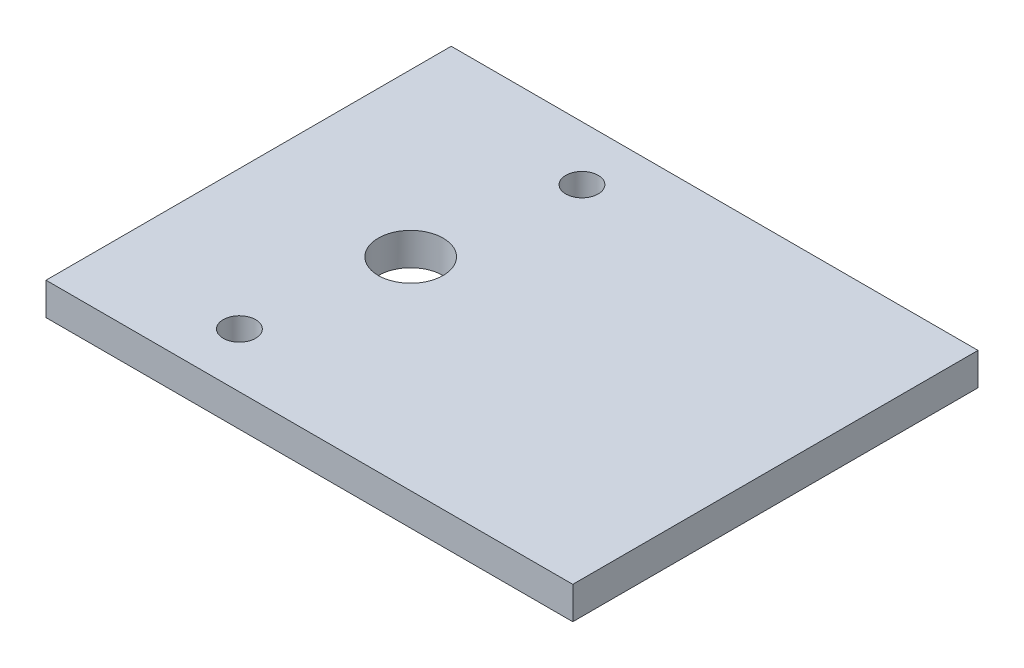
ISO-10303-21;
HEADER;
FILE_DESCRIPTION(('STEP AP214'),'2;1');
FILE_NAME('part.step','',(''),(''),'','','');
FILE_SCHEMA(('AUTOMOTIVE_DESIGN { 1 0 10303 214 1 1 1 1 }'));
ENDSEC;
DATA;
#1=APPLICATION_CONTEXT('core data for automotive mechanical design processes');
#2=APPLICATION_PROTOCOL_DEFINITION('international standard','automotive_design',2000,#1);
#3=PRODUCT_CONTEXT('',#1,'mechanical');
#4=PRODUCT('Part','Part','',(#3));
#5=PRODUCT_RELATED_PRODUCT_CATEGORY('part','',(#4));
#6=PRODUCT_DEFINITION_FORMATION('','',#4);
#7=PRODUCT_DEFINITION_CONTEXT('part definition',#1,'design');
#8=PRODUCT_DEFINITION('design','',#6,#7);
#9=PRODUCT_DEFINITION_SHAPE('','',#8);
#10=(LENGTH_UNIT() NAMED_UNIT(*) SI_UNIT(.MILLI.,.METRE.));
#11=(NAMED_UNIT(*) PLANE_ANGLE_UNIT() SI_UNIT($,.RADIAN.));
#12=(NAMED_UNIT(*) SI_UNIT($,.STERADIAN.) SOLID_ANGLE_UNIT());
#13=UNCERTAINTY_MEASURE_WITH_UNIT(LENGTH_MEASURE(1.E-05),#10,'distance_accuracy_value','');
#14=(GEOMETRIC_REPRESENTATION_CONTEXT(3) GLOBAL_UNCERTAINTY_ASSIGNED_CONTEXT((#13)) GLOBAL_UNIT_ASSIGNED_CONTEXT((#10,
#11,#12)) REPRESENTATION_CONTEXT('',''));
#15=CARTESIAN_POINT('',(0.,0.,0.));
#16=DIRECTION('',(0.,0.,1.));
#17=DIRECTION('',(1.,0.,0.));
#18=AXIS2_PLACEMENT_3D('',#15,#16,#17);
#19=CARTESIAN_POINT('',(0.,0.,50.));
#20=DIRECTION('',(1.,0.,0.));
#21=DIRECTION('',(0.,0.,-1.));
#22=AXIS2_PLACEMENT_3D('',#19,#20,#21);
#23=PLANE('',#22);
#24=DIRECTION('',(0.,-1.,0.));
#25=VECTOR('',#24,1.);
#26=CARTESIAN_POINT('',(0.,0.,0.));
#27=LINE('',#26,#25);
#28=CARTESIAN_POINT('',(0.,4.,0.));
#29=VERTEX_POINT('',#28);
#30=CARTESIAN_POINT('',(0.,0.,0.));
#31=VERTEX_POINT('',#30);
#32=EDGE_CURVE('E89',#29,#31,#27,.T.);
#33=ORIENTED_EDGE('',*,*,#32,.T.);
#34=DIRECTION('',(0.,0.,-1.));
#35=VECTOR('',#34,1.);
#36=CARTESIAN_POINT('',(0.,0.,50.));
#37=LINE('',#36,#35);
#38=CARTESIAN_POINT('',(0.,0.,50.));
#39=VERTEX_POINT('',#38);
#40=EDGE_CURVE('E44',#39,#31,#37,.T.);
#41=ORIENTED_EDGE('',*,*,#40,.F.);
#42=DIRECTION('',(0.,-1.,0.));
#43=VECTOR('',#42,1.);
#44=CARTESIAN_POINT('',(0.,0.,50.));
#45=LINE('',#44,#43);
#46=CARTESIAN_POINT('',(0.,4.,50.));
#47=VERTEX_POINT('',#46);
#48=EDGE_CURVE('E83',#47,#39,#45,.T.);
#49=ORIENTED_EDGE('',*,*,#48,.F.);
#50=DIRECTION('',(0.,0.,-1.));
#51=VECTOR('',#50,1.);
#52=CARTESIAN_POINT('',(0.,4.,50.));
#53=LINE('',#52,#51);
#54=EDGE_CURVE('E76',#47,#29,#53,.T.);
#55=ORIENTED_EDGE('',*,*,#54,.T.);
#56=EDGE_LOOP('',(#33,#41,#49,#55));
#57=FACE_BOUND('',#56,.T.);
#58=ADVANCED_FACE('F37',(#57),#23,.F.);
#59=CARTESIAN_POINT('',(90.,0.,50.));
#60=DIRECTION('',(0.,1.,0.));
#61=DIRECTION('',(-1.,0.,0.));
#62=AXIS2_PLACEMENT_3D('',#59,#60,#61);
#63=PLANE('',#62);
#64=CARTESIAN_POINT('',(17.1436625737536,0.,43.2781655673632));
#65=DIRECTION('',(0.,1.,0.));
#66=DIRECTION('',(-1.,0.,0.));
#67=AXIS2_PLACEMENT_3D('',#64,#65,#66);
#68=CIRCLE('',#67,1.99999999967667);
#69=CARTESIAN_POINT('',(15.1436625740769,0.,43.2781655673632));
#70=VERTEX_POINT('',#69);
#71=EDGE_CURVE('E115',#70,#70,#68,.T.);
#72=ORIENTED_EDGE('',*,*,#71,.T.);
#73=EDGE_LOOP('',(#72));
#74=FACE_BOUND('',#73,.T.);
#75=CARTESIAN_POINT('',(22.8563374269904,0.,6.72183443278139));
#76=DIRECTION('',(0.,1.,0.));
#77=DIRECTION('',(-1.,0.,0.));
#78=AXIS2_PLACEMENT_3D('',#75,#76,#77);
#79=CIRCLE('',#78,1.99999999965383);
#80=CARTESIAN_POINT('',(20.8563374273365,0.,6.72183443278139));
#81=VERTEX_POINT('',#80);
#82=EDGE_CURVE('E116',#81,#81,#79,.T.);
#83=ORIENTED_EDGE('',*,*,#82,.T.);
#84=EDGE_LOOP('',(#83));
#85=FACE_BOUND('',#84,.T.);
#86=CARTESIAN_POINT('',(20.,0.,25.));
#87=DIRECTION('',(0.,1.,0.));
#88=DIRECTION('',(-1.,0.,0.));
#89=AXIS2_PLACEMENT_3D('',#86,#87,#88);
#90=CIRCLE('',#89,4.);
#91=CARTESIAN_POINT('',(16.,0.,25.));
#92=VERTEX_POINT('',#91);
#93=EDGE_CURVE('E94',#92,#92,#90,.T.);
#94=ORIENTED_EDGE('',*,*,#93,.T.);
#95=EDGE_LOOP('',(#94));
#96=FACE_BOUND('',#95,.T.);
#97=DIRECTION('',(1.,0.,0.));
#98=VECTOR('',#97,1.);
#99=CARTESIAN_POINT('',(90.,0.,0.));
#100=LINE('',#99,#98);
#101=CARTESIAN_POINT('',(65.,0.,0.));
#102=VERTEX_POINT('',#101);
#103=EDGE_CURVE('E84',#31,#102,#100,.T.);
#104=ORIENTED_EDGE('',*,*,#103,.T.);
#105=DIRECTION('',(0.,0.,1.));
#106=VECTOR('',#105,1.);
#107=CARTESIAN_POINT('',(65.,0.,50.));
#108=LINE('',#107,#106);
#109=CARTESIAN_POINT('',(65.,0.,50.));
#110=VERTEX_POINT('',#109);
#111=EDGE_CURVE('E50',#102,#110,#108,.T.);
#112=ORIENTED_EDGE('',*,*,#111,.T.);
#113=DIRECTION('',(1.,0.,0.));
#114=VECTOR('',#113,1.);
#115=CARTESIAN_POINT('',(90.,0.,50.));
#116=LINE('',#115,#114);
#117=EDGE_CURVE('E105',#39,#110,#116,.T.);
#118=ORIENTED_EDGE('',*,*,#117,.F.);
#119=ORIENTED_EDGE('',*,*,#40,.T.);
#120=EDGE_LOOP('',(#104,#112,#118,#119));
#121=FACE_BOUND('',#120,.T.);
#122=ADVANCED_FACE('F103',(#74,#85,#96,#121),#63,.F.);
#123=CARTESIAN_POINT('',(0.,4.,50.));
#124=DIRECTION('',(0.,-1.,0.));
#125=DIRECTION('',(1.,0.,0.));
#126=AXIS2_PLACEMENT_3D('',#123,#124,#125);
#127=PLANE('',#126);
#128=CARTESIAN_POINT('',(17.1436625737536,4.,43.2781655673632));
#129=DIRECTION('',(0.,1.,0.));
#130=DIRECTION('',(-1.,0.,0.));
#131=AXIS2_PLACEMENT_3D('',#128,#129,#130);
#132=CIRCLE('',#131,1.99999999967667);
#133=CARTESIAN_POINT('',(15.1436625740769,4.,43.2781655673632));
#134=VERTEX_POINT('',#133);
#135=EDGE_CURVE('E122',#134,#134,#132,.T.);
#136=ORIENTED_EDGE('',*,*,#135,.F.);
#137=EDGE_LOOP('',(#136));
#138=FACE_BOUND('',#137,.T.);
#139=CARTESIAN_POINT('',(22.8563374269904,4.00000000000001,6.72183443278139));
#140=DIRECTION('',(0.,1.,0.));
#141=DIRECTION('',(-1.,0.,0.));
#142=AXIS2_PLACEMENT_3D('',#139,#140,#141);
#143=CIRCLE('',#142,1.99999999965383);
#144=CARTESIAN_POINT('',(20.8563374273365,4.00000000000001,6.72183443278139));
#145=VERTEX_POINT('',#144);
#146=EDGE_CURVE('E119',#145,#145,#143,.T.);
#147=ORIENTED_EDGE('',*,*,#146,.F.);
#148=EDGE_LOOP('',(#147));
#149=FACE_BOUND('',#148,.T.);
#150=CARTESIAN_POINT('',(20.,4.,25.));
#151=DIRECTION('',(0.,1.,0.));
#152=DIRECTION('',(0.,0.,1.));
#153=AXIS2_PLACEMENT_3D('',#150,#151,#152);
#154=CIRCLE('',#153,4.);
#155=CARTESIAN_POINT('',(20.,4.,29.));
#156=VERTEX_POINT('',#155);
#157=EDGE_CURVE('E98',#156,#156,#154,.T.);
#158=ORIENTED_EDGE('',*,*,#157,.F.);
#159=EDGE_LOOP('',(#158));
#160=FACE_BOUND('',#159,.T.);
#161=DIRECTION('',(-1.,0.,0.));
#162=VECTOR('',#161,1.);
#163=CARTESIAN_POINT('',(4.,4.,50.));
#164=LINE('',#163,#162);
#165=CARTESIAN_POINT('',(65.,4.00000000000001,50.));
#166=VERTEX_POINT('',#165);
#167=EDGE_CURVE('E59',#166,#47,#164,.T.);
#168=ORIENTED_EDGE('',*,*,#167,.F.);
#169=DIRECTION('',(0.,0.,1.));
#170=VECTOR('',#169,1.);
#171=CARTESIAN_POINT('',(65.,4.00000000000001,0.));
#172=LINE('',#171,#170);
#173=CARTESIAN_POINT('',(65.,4.00000000000001,0.));
#174=VERTEX_POINT('',#173);
#175=EDGE_CURVE('E80',#174,#166,#172,.T.);
#176=ORIENTED_EDGE('',*,*,#175,.F.);
#177=DIRECTION('',(-1.,0.,0.));
#178=VECTOR('',#177,1.);
#179=CARTESIAN_POINT('',(0.,4.,0.));
#180=LINE('',#179,#178);
#181=EDGE_CURVE('E73',#174,#29,#180,.T.);
#182=ORIENTED_EDGE('',*,*,#181,.T.);
#183=ORIENTED_EDGE('',*,*,#54,.F.);
#184=EDGE_LOOP('',(#168,#176,#182,#183));
#185=FACE_BOUND('',#184,.T.);
#186=ADVANCED_FACE('F75',(#138,#149,#160,#185),#127,.F.);
#187=CARTESIAN_POINT('',(0.,0.,50.));
#188=DIRECTION('',(0.,0.,-1.));
#189=DIRECTION('',(-1.,0.,0.));
#190=AXIS2_PLACEMENT_3D('',#187,#188,#189);
#191=PLANE('',#190);
#192=ORIENTED_EDGE('',*,*,#117,.T.);
#193=DIRECTION('',(0.,1.,0.));
#194=VECTOR('',#193,1.);
#195=CARTESIAN_POINT('',(65.,-5.99999999999999,50.));
#196=LINE('',#195,#194);
#197=EDGE_CURVE('E112',#110,#166,#196,.T.);
#198=ORIENTED_EDGE('',*,*,#197,.T.);
#199=ORIENTED_EDGE('',*,*,#167,.T.);
#200=ORIENTED_EDGE('',*,*,#48,.T.);
#201=EDGE_LOOP('',(#192,#198,#199,#200));
#202=FACE_BOUND('',#201,.T.);
#203=ADVANCED_FACE('F106',(#202),#191,.F.);
#204=CARTESIAN_POINT('',(0.,0.,0.));
#205=DIRECTION('',(0.,0.,-1.));
#206=DIRECTION('',(-1.,0.,0.));
#207=AXIS2_PLACEMENT_3D('',#204,#205,#206);
#208=PLANE('',#207);
#209=DIRECTION('',(0.,1.,0.));
#210=VECTOR('',#209,1.);
#211=CARTESIAN_POINT('',(65.,0.,0.));
#212=LINE('',#211,#210);
#213=EDGE_CURVE('E11',#102,#174,#212,.T.);
#214=ORIENTED_EDGE('',*,*,#213,.F.);
#215=ORIENTED_EDGE('',*,*,#103,.F.);
#216=ORIENTED_EDGE('',*,*,#32,.F.);
#217=ORIENTED_EDGE('',*,*,#181,.F.);
#218=EDGE_LOOP('',(#214,#215,#216,#217));
#219=FACE_BOUND('',#218,.T.);
#220=ADVANCED_FACE('F91',(#219),#208,.T.);
#221=CARTESIAN_POINT('',(20.,-6.,25.));
#222=DIRECTION('',(0.,1.,0.));
#223=DIRECTION('',(0.,0.,1.));
#224=AXIS2_PLACEMENT_3D('',#221,#222,#223);
#225=CYLINDRICAL_SURFACE('',#224,4.);
#226=ORIENTED_EDGE('',*,*,#157,.T.);
#227=EDGE_LOOP('',(#226));
#228=FACE_BOUND('',#227,.T.);
#229=ORIENTED_EDGE('',*,*,#93,.F.);
#230=EDGE_LOOP('',(#229));
#231=FACE_BOUND('',#230,.T.);
#232=ADVANCED_FACE('F144',(#228,#231),#225,.F.);
#233=CARTESIAN_POINT('',(65.,-5.99999999999999,0.));
#234=DIRECTION('',(-1.,0.,0.));
#235=DIRECTION('',(0.,-1.,0.));
#236=AXIS2_PLACEMENT_3D('',#233,#234,#235);
#237=PLANE('',#236);
#238=ORIENTED_EDGE('',*,*,#213,.T.);
#239=ORIENTED_EDGE('',*,*,#175,.T.);
#240=ORIENTED_EDGE('',*,*,#197,.F.);
#241=ORIENTED_EDGE('',*,*,#111,.F.);
#242=EDGE_LOOP('',(#238,#239,#240,#241));
#243=FACE_BOUND('',#242,.T.);
#244=ADVANCED_FACE('F147',(#243),#237,.F.);
#245=CARTESIAN_POINT('',(22.8563374269904,0.,6.72183443278139));
#246=DIRECTION('',(0.,1.,0.));
#247=DIRECTION('',(-1.,0.,0.));
#248=AXIS2_PLACEMENT_3D('',#245,#246,#247);
#249=CYLINDRICAL_SURFACE('',#248,1.99999999965383);
#250=ORIENTED_EDGE('',*,*,#82,.F.);
#251=EDGE_LOOP('',(#250));
#252=FACE_BOUND('',#251,.T.);
#253=ORIENTED_EDGE('',*,*,#146,.T.);
#254=EDGE_LOOP('',(#253));
#255=FACE_BOUND('',#254,.T.);
#256=ADVANCED_FACE('F133',(#252,#255),#249,.F.);
#257=CARTESIAN_POINT('',(17.1436625737536,0.,43.2781655673632));
#258=DIRECTION('',(0.,1.,0.));
#259=DIRECTION('',(-1.,0.,0.));
#260=AXIS2_PLACEMENT_3D('',#257,#258,#259);
#261=CYLINDRICAL_SURFACE('',#260,1.99999999967667);
#262=ORIENTED_EDGE('',*,*,#71,.F.);
#263=EDGE_LOOP('',(#262));
#264=FACE_BOUND('',#263,.T.);
#265=ORIENTED_EDGE('',*,*,#135,.T.);
#266=EDGE_LOOP('',(#265));
#267=FACE_BOUND('',#266,.T.);
#268=ADVANCED_FACE('F130',(#264,#267),#261,.F.);
#269=CLOSED_SHELL('',(#58,#122,#186,#203,#220,#232,#244,#256,#268));
#270=MANIFOLD_SOLID_BREP('B2',#269);
#271=ADVANCED_BREP_SHAPE_REPRESENTATION('',(#18,#270),#14);
#272=SHAPE_DEFINITION_REPRESENTATION(#9,#271);
ENDSEC;
END-ISO-10303-21;
